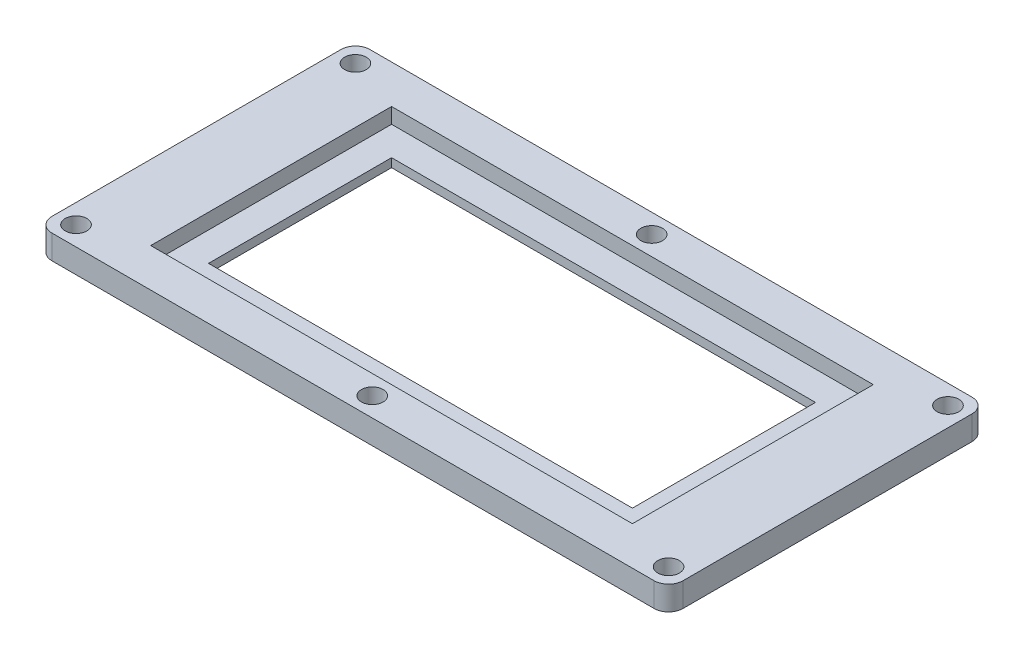
ISO-10303-21;
HEADER;
FILE_DESCRIPTION(('STEP AP214'),'2;1');
FILE_NAME('part.step','',(''),(''),'','','');
FILE_SCHEMA(('AUTOMOTIVE_DESIGN { 1 0 10303 214 1 1 1 1 }'));
ENDSEC;
DATA;
#1=APPLICATION_CONTEXT('core data for automotive mechanical design processes');
#2=APPLICATION_PROTOCOL_DEFINITION('international standard','automotive_design',2000,#1);
#3=PRODUCT_CONTEXT('',#1,'mechanical');
#4=PRODUCT('Part','Part','',(#3));
#5=PRODUCT_RELATED_PRODUCT_CATEGORY('part','',(#4));
#6=PRODUCT_DEFINITION_FORMATION('','',#4);
#7=PRODUCT_DEFINITION_CONTEXT('part definition',#1,'design');
#8=PRODUCT_DEFINITION('design','',#6,#7);
#9=PRODUCT_DEFINITION_SHAPE('','',#8);
#10=(LENGTH_UNIT() NAMED_UNIT(*) SI_UNIT(.MILLI.,.METRE.));
#11=(NAMED_UNIT(*) PLANE_ANGLE_UNIT() SI_UNIT($,.RADIAN.));
#12=(NAMED_UNIT(*) SI_UNIT($,.STERADIAN.) SOLID_ANGLE_UNIT());
#13=UNCERTAINTY_MEASURE_WITH_UNIT(LENGTH_MEASURE(1.E-05),#10,'distance_accuracy_value','');
#14=(GEOMETRIC_REPRESENTATION_CONTEXT(3) GLOBAL_UNCERTAINTY_ASSIGNED_CONTEXT((#13)) GLOBAL_UNIT_ASSIGNED_CONTEXT((#10,
#11,#12)) REPRESENTATION_CONTEXT('',''));
#15=CARTESIAN_POINT('',(0.,0.,0.));
#16=DIRECTION('',(0.,0.,1.));
#17=DIRECTION('',(1.,0.,0.));
#18=AXIS2_PLACEMENT_3D('',#15,#16,#17);
#19=CARTESIAN_POINT('',(65.5,5.,33.));
#20=DIRECTION('',(-1.,0.,0.));
#21=DIRECTION('',(0.,0.,1.));
#22=AXIS2_PLACEMENT_3D('',#19,#20,#21);
#23=PLANE('',#22);
#24=DIRECTION('',(0.,0.,-1.));
#25=VECTOR('',#24,1.);
#26=CARTESIAN_POINT('',(65.5,0.,33.));
#27=LINE('',#26,#25);
#28=CARTESIAN_POINT('',(65.5,0.,30.));
#29=VERTEX_POINT('',#28);
#30=CARTESIAN_POINT('',(65.5,0.,-30.));
#31=VERTEX_POINT('',#30);
#32=EDGE_CURVE('E251',#29,#31,#27,.T.);
#33=ORIENTED_EDGE('',*,*,#32,.T.);
#34=DIRECTION('',(0.,-1.,0.));
#35=VECTOR('',#34,1.);
#36=CARTESIAN_POINT('',(65.5,5.,-30.));
#37=LINE('',#36,#35);
#38=CARTESIAN_POINT('',(65.5,5.,-30.));
#39=VERTEX_POINT('',#38);
#40=EDGE_CURVE('E293',#31,#39,#37,.F.);
#41=ORIENTED_EDGE('',*,*,#40,.T.);
#42=DIRECTION('',(0.,0.,-1.));
#43=VECTOR('',#42,1.);
#44=CARTESIAN_POINT('',(65.5,5.,33.));
#45=LINE('',#44,#43);
#46=CARTESIAN_POINT('',(65.5,5.,30.));
#47=VERTEX_POINT('',#46);
#48=EDGE_CURVE('E254',#47,#39,#45,.T.);
#49=ORIENTED_EDGE('',*,*,#48,.F.);
#50=DIRECTION('',(0.,-1.,0.));
#51=VECTOR('',#50,1.);
#52=CARTESIAN_POINT('',(65.5,5.,30.));
#53=LINE('',#52,#51);
#54=EDGE_CURVE('E290',#47,#29,#53,.T.);
#55=ORIENTED_EDGE('',*,*,#54,.T.);
#56=EDGE_LOOP('',(#33,#41,#49,#55));
#57=FACE_BOUND('',#56,.T.);
#58=ADVANCED_FACE('F36',(#57),#23,.F.);
#59=CARTESIAN_POINT('',(-65.5,5.,-33.));
#60=DIRECTION('',(0.,0.,1.));
#61=DIRECTION('',(1.,0.,0.));
#62=AXIS2_PLACEMENT_3D('',#59,#60,#61);
#63=PLANE('',#62);
#64=DIRECTION('',(-1.,0.,0.));
#65=VECTOR('',#64,1.);
#66=CARTESIAN_POINT('',(-65.5,5.,-33.));
#67=LINE('',#66,#65);
#68=CARTESIAN_POINT('',(62.5,5.,-33.));
#69=VERTEX_POINT('',#68);
#70=CARTESIAN_POINT('',(-62.5,5.,-33.));
#71=VERTEX_POINT('',#70);
#72=EDGE_CURVE('E257',#69,#71,#67,.T.);
#73=ORIENTED_EDGE('',*,*,#72,.F.);
#74=DIRECTION('',(0.,-1.,0.));
#75=VECTOR('',#74,1.);
#76=CARTESIAN_POINT('',(62.5,5.,-33.));
#77=LINE('',#76,#75);
#78=CARTESIAN_POINT('',(62.5,0.,-33.));
#79=VERTEX_POINT('',#78);
#80=EDGE_CURVE('E279',#69,#79,#77,.T.);
#81=ORIENTED_EDGE('',*,*,#80,.T.);
#82=DIRECTION('',(-1.,0.,0.));
#83=VECTOR('',#82,1.);
#84=CARTESIAN_POINT('',(-65.5,0.,-33.));
#85=LINE('',#84,#83);
#86=CARTESIAN_POINT('',(-62.5,0.,-33.));
#87=VERTEX_POINT('',#86);
#88=EDGE_CURVE('E270',#79,#87,#85,.T.);
#89=ORIENTED_EDGE('',*,*,#88,.T.);
#90=DIRECTION('',(0.,-1.,0.));
#91=VECTOR('',#90,1.);
#92=CARTESIAN_POINT('',(-62.5,5.,-33.));
#93=LINE('',#92,#91);
#94=EDGE_CURVE('E267',#87,#71,#93,.F.);
#95=ORIENTED_EDGE('',*,*,#94,.T.);
#96=EDGE_LOOP('',(#73,#81,#89,#95));
#97=FACE_BOUND('',#96,.T.);
#98=ADVANCED_FACE('F335',(#97),#63,.F.);
#99=CARTESIAN_POINT('',(-65.5,5.,33.));
#100=DIRECTION('',(1.,0.,0.));
#101=DIRECTION('',(0.,0.,-1.));
#102=AXIS2_PLACEMENT_3D('',#99,#100,#101);
#103=PLANE('',#102);
#104=DIRECTION('',(0.,0.,1.));
#105=VECTOR('',#104,1.);
#106=CARTESIAN_POINT('',(-65.5,5.,33.));
#107=LINE('',#106,#105);
#108=CARTESIAN_POINT('',(-65.5,5.,-30.));
#109=VERTEX_POINT('',#108);
#110=CARTESIAN_POINT('',(-65.5,5.,30.));
#111=VERTEX_POINT('',#110);
#112=EDGE_CURVE('E261',#109,#111,#107,.T.);
#113=ORIENTED_EDGE('',*,*,#112,.F.);
#114=DIRECTION('',(0.,-1.,0.));
#115=VECTOR('',#114,1.);
#116=CARTESIAN_POINT('',(-65.5,5.,-30.));
#117=LINE('',#116,#115);
#118=CARTESIAN_POINT('',(-65.5,0.,-30.));
#119=VERTEX_POINT('',#118);
#120=EDGE_CURVE('E305',#109,#119,#117,.T.);
#121=ORIENTED_EDGE('',*,*,#120,.T.);
#122=DIRECTION('',(0.,0.,1.));
#123=VECTOR('',#122,1.);
#124=CARTESIAN_POINT('',(-65.5,0.,33.));
#125=LINE('',#124,#123);
#126=CARTESIAN_POINT('',(-65.5,0.,30.));
#127=VERTEX_POINT('',#126);
#128=EDGE_CURVE('E273',#119,#127,#125,.T.);
#129=ORIENTED_EDGE('',*,*,#128,.T.);
#130=DIRECTION('',(0.,-1.,0.));
#131=VECTOR('',#130,1.);
#132=CARTESIAN_POINT('',(-65.5,5.,30.));
#133=LINE('',#132,#131);
#134=EDGE_CURVE('E303',#127,#111,#133,.F.);
#135=ORIENTED_EDGE('',*,*,#134,.T.);
#136=EDGE_LOOP('',(#113,#121,#129,#135));
#137=FACE_BOUND('',#136,.T.);
#138=ADVANCED_FACE('F343',(#137),#103,.F.);
#139=CARTESIAN_POINT('',(-65.5,5.,33.));
#140=DIRECTION('',(0.,0.,-1.));
#141=DIRECTION('',(-1.,0.,0.));
#142=AXIS2_PLACEMENT_3D('',#139,#140,#141);
#143=PLANE('',#142);
#144=DIRECTION('',(1.,0.,0.));
#145=VECTOR('',#144,1.);
#146=CARTESIAN_POINT('',(-65.5,0.,33.));
#147=LINE('',#146,#145);
#148=CARTESIAN_POINT('',(-62.5,0.,33.));
#149=VERTEX_POINT('',#148);
#150=CARTESIAN_POINT('',(62.5,0.,33.));
#151=VERTEX_POINT('',#150);
#152=EDGE_CURVE('E258',#149,#151,#147,.T.);
#153=ORIENTED_EDGE('',*,*,#152,.T.);
#154=DIRECTION('',(0.,-1.,0.));
#155=VECTOR('',#154,1.);
#156=CARTESIAN_POINT('',(62.5,5.,33.));
#157=LINE('',#156,#155);
#158=CARTESIAN_POINT('',(62.5,5.,33.));
#159=VERTEX_POINT('',#158);
#160=EDGE_CURVE('E11',#151,#159,#157,.F.);
#161=ORIENTED_EDGE('',*,*,#160,.T.);
#162=DIRECTION('',(1.,0.,0.));
#163=VECTOR('',#162,1.);
#164=CARTESIAN_POINT('',(-65.5,5.,33.));
#165=LINE('',#164,#163);
#166=CARTESIAN_POINT('',(-62.5,5.,33.));
#167=VERTEX_POINT('',#166);
#168=EDGE_CURVE('E264',#167,#159,#165,.T.);
#169=ORIENTED_EDGE('',*,*,#168,.F.);
#170=DIRECTION('',(0.,-1.,0.));
#171=VECTOR('',#170,1.);
#172=CARTESIAN_POINT('',(-62.5,5.,33.));
#173=LINE('',#172,#171);
#174=EDGE_CURVE('E44',#167,#149,#173,.T.);
#175=ORIENTED_EDGE('',*,*,#174,.T.);
#176=EDGE_LOOP('',(#153,#161,#169,#175));
#177=FACE_BOUND('',#176,.T.);
#178=ADVANCED_FACE('F312',(#177),#143,.F.);
#179=CARTESIAN_POINT('',(0.,5.,0.));
#180=DIRECTION('',(0.,-1.,0.));
#181=DIRECTION('',(0.,0.,-1.));
#182=AXIS2_PLACEMENT_3D('',#179,#180,#181);
#183=PLANE('',#182);
#184=DIRECTION('',(1.,0.,0.));
#185=VECTOR('',#184,1.);
#186=CARTESIAN_POINT('',(50.,5.,25.));
#187=LINE('',#186,#185);
#188=CARTESIAN_POINT('',(-50.,5.,25.));
#189=VERTEX_POINT('',#188);
#190=CARTESIAN_POINT('',(50.,5.,25.));
#191=VERTEX_POINT('',#190);
#192=EDGE_CURVE('E201',#189,#191,#187,.T.);
#193=ORIENTED_EDGE('',*,*,#192,.F.);
#194=DIRECTION('',(0.,0.,1.));
#195=VECTOR('',#194,1.);
#196=CARTESIAN_POINT('',(-50.,5.,25.));
#197=LINE('',#196,#195);
#198=CARTESIAN_POINT('',(-50.,5.,-25.));
#199=VERTEX_POINT('',#198);
#200=EDGE_CURVE('E182',#199,#189,#197,.T.);
#201=ORIENTED_EDGE('',*,*,#200,.F.);
#202=DIRECTION('',(-1.,0.,0.));
#203=VECTOR('',#202,1.);
#204=CARTESIAN_POINT('',(50.,5.,-25.));
#205=LINE('',#204,#203);
#206=CARTESIAN_POINT('',(50.,5.,-25.));
#207=VERTEX_POINT('',#206);
#208=EDGE_CURVE('E190',#207,#199,#205,.T.);
#209=ORIENTED_EDGE('',*,*,#208,.F.);
#210=DIRECTION('',(0.,0.,-1.));
#211=VECTOR('',#210,1.);
#212=CARTESIAN_POINT('',(50.,5.,25.));
#213=LINE('',#212,#211);
#214=EDGE_CURVE('E204',#191,#207,#213,.T.);
#215=ORIENTED_EDGE('',*,*,#214,.F.);
#216=EDGE_LOOP('',(#193,#201,#209,#215));
#217=FACE_BOUND('',#216,.T.);
#218=CARTESIAN_POINT('',(61.5,5.,-29.));
#219=DIRECTION('',(0.,1.,0.));
#220=DIRECTION('',(0.,0.,1.));
#221=AXIS2_PLACEMENT_3D('',#218,#219,#220);
#222=CIRCLE('',#221,2.25);
#223=CARTESIAN_POINT('',(61.5,5.,-26.75));
#224=VERTEX_POINT('',#223);
#225=EDGE_CURVE('E228',#224,#224,#222,.T.);
#226=ORIENTED_EDGE('',*,*,#225,.F.);
#227=EDGE_LOOP('',(#226));
#228=FACE_BOUND('',#227,.T.);
#229=CARTESIAN_POINT('',(61.5,5.,29.));
#230=DIRECTION('',(0.,1.,0.));
#231=DIRECTION('',(0.,0.,1.));
#232=AXIS2_PLACEMENT_3D('',#229,#230,#231);
#233=CIRCLE('',#232,2.25);
#234=CARTESIAN_POINT('',(61.5,5.,31.25));
#235=VERTEX_POINT('',#234);
#236=EDGE_CURVE('E234',#235,#235,#233,.T.);
#237=ORIENTED_EDGE('',*,*,#236,.F.);
#238=EDGE_LOOP('',(#237));
#239=FACE_BOUND('',#238,.T.);
#240=CARTESIAN_POINT('',(-61.5,5.,29.));
#241=DIRECTION('',(0.,1.,0.));
#242=DIRECTION('',(0.,0.,1.));
#243=AXIS2_PLACEMENT_3D('',#240,#241,#242);
#244=CIRCLE('',#243,2.25);
#245=CARTESIAN_POINT('',(-61.5,5.,31.25));
#246=VERTEX_POINT('',#245);
#247=EDGE_CURVE('E240',#246,#246,#244,.T.);
#248=ORIENTED_EDGE('',*,*,#247,.F.);
#249=EDGE_LOOP('',(#248));
#250=FACE_BOUND('',#249,.T.);
#251=CARTESIAN_POINT('',(0.,5.,-29.));
#252=DIRECTION('',(0.,1.,0.));
#253=DIRECTION('',(0.,0.,1.));
#254=AXIS2_PLACEMENT_3D('',#251,#252,#253);
#255=CIRCLE('',#254,2.25);
#256=CARTESIAN_POINT('',(0.,5.,-26.75));
#257=VERTEX_POINT('',#256);
#258=EDGE_CURVE('E221',#257,#257,#255,.T.);
#259=ORIENTED_EDGE('',*,*,#258,.F.);
#260=EDGE_LOOP('',(#259));
#261=FACE_BOUND('',#260,.T.);
#262=CARTESIAN_POINT('',(0.,5.,29.));
#263=DIRECTION('',(0.,1.,0.));
#264=DIRECTION('',(0.,0.,1.));
#265=AXIS2_PLACEMENT_3D('',#262,#263,#264);
#266=CIRCLE('',#265,2.25);
#267=CARTESIAN_POINT('',(0.,5.,31.25));
#268=VERTEX_POINT('',#267);
#269=EDGE_CURVE('E211',#268,#268,#266,.T.);
#270=ORIENTED_EDGE('',*,*,#269,.F.);
#271=EDGE_LOOP('',(#270));
#272=FACE_BOUND('',#271,.T.);
#273=CARTESIAN_POINT('',(-61.5,5.,-29.));
#274=DIRECTION('',(0.,1.,0.));
#275=DIRECTION('',(0.,0.,1.));
#276=AXIS2_PLACEMENT_3D('',#273,#274,#275);
#277=CIRCLE('',#276,2.25);
#278=CARTESIAN_POINT('',(-61.5,5.,-26.75));
#279=VERTEX_POINT('',#278);
#280=EDGE_CURVE('E227',#279,#279,#277,.T.);
#281=ORIENTED_EDGE('',*,*,#280,.F.);
#282=EDGE_LOOP('',(#281));
#283=FACE_BOUND('',#282,.T.);
#284=ORIENTED_EDGE('',*,*,#48,.T.);
#285=CARTESIAN_POINT('',(62.5,5.,-30.));
#286=DIRECTION('',(0.,-1.,0.));
#287=DIRECTION('',(0.,0.,-1.));
#288=AXIS2_PLACEMENT_3D('',#285,#286,#287);
#289=CIRCLE('',#288,3.);
#290=EDGE_CURVE('E301',#39,#69,#289,.F.);
#291=ORIENTED_EDGE('',*,*,#290,.T.);
#292=ORIENTED_EDGE('',*,*,#72,.T.);
#293=CARTESIAN_POINT('',(-62.5,5.,-30.));
#294=DIRECTION('',(0.,-1.,0.));
#295=DIRECTION('',(0.,0.,-1.));
#296=AXIS2_PLACEMENT_3D('',#293,#294,#295);
#297=CIRCLE('',#296,3.);
#298=EDGE_CURVE('E299',#71,#109,#297,.F.);
#299=ORIENTED_EDGE('',*,*,#298,.T.);
#300=ORIENTED_EDGE('',*,*,#112,.T.);
#301=CARTESIAN_POINT('',(-62.5,5.,30.));
#302=DIRECTION('',(0.,-1.,0.));
#303=DIRECTION('',(0.,0.,-1.));
#304=AXIS2_PLACEMENT_3D('',#301,#302,#303);
#305=CIRCLE('',#304,3.);
#306=EDGE_CURVE('E295',#111,#167,#305,.F.);
#307=ORIENTED_EDGE('',*,*,#306,.T.);
#308=ORIENTED_EDGE('',*,*,#168,.T.);
#309=CARTESIAN_POINT('',(62.5,5.,30.));
#310=DIRECTION('',(0.,-1.,0.));
#311=DIRECTION('',(0.,0.,-1.));
#312=AXIS2_PLACEMENT_3D('',#309,#310,#311);
#313=CIRCLE('',#312,3.);
#314=EDGE_CURVE('E297',#159,#47,#313,.F.);
#315=ORIENTED_EDGE('',*,*,#314,.T.);
#316=EDGE_LOOP('',(#284,#291,#292,#299,#300,#307,#308,#315));
#317=FACE_BOUND('',#316,.T.);
#318=ADVANCED_FACE('F329',(#217,#228,#239,#250,#261,#272,#283,#317),#183,.F.);
#319=CARTESIAN_POINT('',(0.,0.,0.));
#320=DIRECTION('',(0.,-1.,0.));
#321=DIRECTION('',(0.,0.,-1.));
#322=AXIS2_PLACEMENT_3D('',#319,#320,#321);
#323=PLANE('',#322);
#324=DIRECTION('',(1.,0.,0.));
#325=VECTOR('',#324,1.);
#326=CARTESIAN_POINT('',(-44.,0.,19.));
#327=LINE('',#326,#325);
#328=CARTESIAN_POINT('',(-44.,0.,19.));
#329=VERTEX_POINT('',#328);
#330=CARTESIAN_POINT('',(44.,0.,19.));
#331=VERTEX_POINT('',#330);
#332=EDGE_CURVE('E151',#329,#331,#327,.T.);
#333=ORIENTED_EDGE('',*,*,#332,.T.);
#334=DIRECTION('',(0.,0.,-1.));
#335=VECTOR('',#334,1.);
#336=CARTESIAN_POINT('',(44.,0.,19.));
#337=LINE('',#336,#335);
#338=CARTESIAN_POINT('',(44.,0.,-19.));
#339=VERTEX_POINT('',#338);
#340=EDGE_CURVE('E162',#331,#339,#337,.T.);
#341=ORIENTED_EDGE('',*,*,#340,.T.);
#342=DIRECTION('',(-1.,0.,0.));
#343=VECTOR('',#342,1.);
#344=CARTESIAN_POINT('',(44.,0.,-19.));
#345=LINE('',#344,#343);
#346=CARTESIAN_POINT('',(-44.,0.,-19.));
#347=VERTEX_POINT('',#346);
#348=EDGE_CURVE('E56',#339,#347,#345,.T.);
#349=ORIENTED_EDGE('',*,*,#348,.T.);
#350=DIRECTION('',(0.,0.,1.));
#351=VECTOR('',#350,1.);
#352=CARTESIAN_POINT('',(-44.,0.,-19.));
#353=LINE('',#352,#351);
#354=EDGE_CURVE('E159',#347,#329,#353,.T.);
#355=ORIENTED_EDGE('',*,*,#354,.T.);
#356=EDGE_LOOP('',(#333,#341,#349,#355));
#357=FACE_BOUND('',#356,.T.);
#358=CARTESIAN_POINT('',(61.5,0.,-29.));
#359=DIRECTION('',(0.,1.,0.));
#360=DIRECTION('',(0.,0.,1.));
#361=AXIS2_PLACEMENT_3D('',#358,#359,#360);
#362=CIRCLE('',#361,2.25);
#363=CARTESIAN_POINT('',(61.5,0.,-26.75));
#364=VERTEX_POINT('',#363);
#365=EDGE_CURVE('E224',#364,#364,#362,.T.);
#366=ORIENTED_EDGE('',*,*,#365,.T.);
#367=EDGE_LOOP('',(#366));
#368=FACE_BOUND('',#367,.T.);
#369=CARTESIAN_POINT('',(61.5,0.,29.));
#370=DIRECTION('',(0.,1.,0.));
#371=DIRECTION('',(0.,0.,1.));
#372=AXIS2_PLACEMENT_3D('',#369,#370,#371);
#373=CIRCLE('',#372,2.25);
#374=CARTESIAN_POINT('',(61.5,0.,31.25));
#375=VERTEX_POINT('',#374);
#376=EDGE_CURVE('E231',#375,#375,#373,.T.);
#377=ORIENTED_EDGE('',*,*,#376,.T.);
#378=EDGE_LOOP('',(#377));
#379=FACE_BOUND('',#378,.T.);
#380=CARTESIAN_POINT('',(-61.5,0.,29.));
#381=DIRECTION('',(0.,1.,0.));
#382=DIRECTION('',(0.,0.,1.));
#383=AXIS2_PLACEMENT_3D('',#380,#381,#382);
#384=CIRCLE('',#383,2.25);
#385=CARTESIAN_POINT('',(-61.5,0.,31.25));
#386=VERTEX_POINT('',#385);
#387=EDGE_CURVE('E237',#386,#386,#384,.T.);
#388=ORIENTED_EDGE('',*,*,#387,.T.);
#389=EDGE_LOOP('',(#388));
#390=FACE_BOUND('',#389,.T.);
#391=CARTESIAN_POINT('',(0.,0.,-29.));
#392=DIRECTION('',(0.,1.,0.));
#393=DIRECTION('',(0.,0.,1.));
#394=AXIS2_PLACEMENT_3D('',#391,#392,#393);
#395=CIRCLE('',#394,2.25);
#396=CARTESIAN_POINT('',(0.,0.,-26.75));
#397=VERTEX_POINT('',#396);
#398=EDGE_CURVE('E243',#397,#397,#395,.T.);
#399=ORIENTED_EDGE('',*,*,#398,.T.);
#400=EDGE_LOOP('',(#399));
#401=FACE_BOUND('',#400,.T.);
#402=CARTESIAN_POINT('',(0.,0.,29.));
#403=DIRECTION('',(0.,1.,0.));
#404=DIRECTION('',(0.,0.,1.));
#405=AXIS2_PLACEMENT_3D('',#402,#403,#404);
#406=CIRCLE('',#405,2.25);
#407=CARTESIAN_POINT('',(0.,0.,31.25));
#408=VERTEX_POINT('',#407);
#409=EDGE_CURVE('E218',#408,#408,#406,.T.);
#410=ORIENTED_EDGE('',*,*,#409,.T.);
#411=EDGE_LOOP('',(#410));
#412=FACE_BOUND('',#411,.T.);
#413=CARTESIAN_POINT('',(-61.5,0.,-29.));
#414=DIRECTION('',(0.,1.,0.));
#415=DIRECTION('',(0.,0.,1.));
#416=AXIS2_PLACEMENT_3D('',#413,#414,#415);
#417=CIRCLE('',#416,2.25);
#418=CARTESIAN_POINT('',(-61.5,0.,-26.75));
#419=VERTEX_POINT('',#418);
#420=EDGE_CURVE('E248',#419,#419,#417,.T.);
#421=ORIENTED_EDGE('',*,*,#420,.T.);
#422=EDGE_LOOP('',(#421));
#423=FACE_BOUND('',#422,.T.);
#424=ORIENTED_EDGE('',*,*,#88,.F.);
#425=CARTESIAN_POINT('',(62.5,0.,-30.));
#426=DIRECTION('',(0.,-1.,0.));
#427=DIRECTION('',(0.,0.,-1.));
#428=AXIS2_PLACEMENT_3D('',#425,#426,#427);
#429=CIRCLE('',#428,3.);
#430=EDGE_CURVE('E288',#79,#31,#429,.T.);
#431=ORIENTED_EDGE('',*,*,#430,.T.);
#432=ORIENTED_EDGE('',*,*,#32,.F.);
#433=CARTESIAN_POINT('',(62.5,0.,30.));
#434=DIRECTION('',(0.,-1.,0.));
#435=DIRECTION('',(0.,0.,-1.));
#436=AXIS2_PLACEMENT_3D('',#433,#434,#435);
#437=CIRCLE('',#436,3.);
#438=EDGE_CURVE('E284',#29,#151,#437,.T.);
#439=ORIENTED_EDGE('',*,*,#438,.T.);
#440=ORIENTED_EDGE('',*,*,#152,.F.);
#441=CARTESIAN_POINT('',(-62.5,0.,30.));
#442=DIRECTION('',(0.,-1.,0.));
#443=DIRECTION('',(0.,0.,-1.));
#444=AXIS2_PLACEMENT_3D('',#441,#442,#443);
#445=CIRCLE('',#444,3.);
#446=EDGE_CURVE('E282',#149,#127,#445,.T.);
#447=ORIENTED_EDGE('',*,*,#446,.T.);
#448=ORIENTED_EDGE('',*,*,#128,.F.);
#449=CARTESIAN_POINT('',(-62.5,0.,-30.));
#450=DIRECTION('',(0.,-1.,0.));
#451=DIRECTION('',(0.,0.,-1.));
#452=AXIS2_PLACEMENT_3D('',#449,#450,#451);
#453=CIRCLE('',#452,3.);
#454=EDGE_CURVE('E286',#119,#87,#453,.T.);
#455=ORIENTED_EDGE('',*,*,#454,.T.);
#456=EDGE_LOOP('',(#424,#431,#432,#439,#440,#447,#448,#455));
#457=FACE_BOUND('',#456,.T.);
#458=ADVANCED_FACE('F166',(#357,#368,#379,#390,#401,#412,#423,#457),#323,.T.);
#459=CARTESIAN_POINT('',(62.5,5.,-30.));
#460=DIRECTION('',(0.,-1.,0.));
#461=DIRECTION('',(0.,0.,-1.));
#462=AXIS2_PLACEMENT_3D('',#459,#460,#461);
#463=CYLINDRICAL_SURFACE('',#462,3.);
#464=ORIENTED_EDGE('',*,*,#290,.F.);
#465=ORIENTED_EDGE('',*,*,#40,.F.);
#466=ORIENTED_EDGE('',*,*,#430,.F.);
#467=ORIENTED_EDGE('',*,*,#80,.F.);
#468=EDGE_LOOP('',(#464,#465,#466,#467));
#469=FACE_BOUND('',#468,.T.);
#470=ADVANCED_FACE('F333',(#469),#463,.T.);
#471=CARTESIAN_POINT('',(-62.5,5.,-30.));
#472=DIRECTION('',(0.,-1.,0.));
#473=DIRECTION('',(0.,0.,-1.));
#474=AXIS2_PLACEMENT_3D('',#471,#472,#473);
#475=CYLINDRICAL_SURFACE('',#474,3.);
#476=ORIENTED_EDGE('',*,*,#298,.F.);
#477=ORIENTED_EDGE('',*,*,#94,.F.);
#478=ORIENTED_EDGE('',*,*,#454,.F.);
#479=ORIENTED_EDGE('',*,*,#120,.F.);
#480=EDGE_LOOP('',(#476,#477,#478,#479));
#481=FACE_BOUND('',#480,.T.);
#482=ADVANCED_FACE('F340',(#481),#475,.T.);
#483=CARTESIAN_POINT('',(62.5,5.,30.));
#484=DIRECTION('',(0.,-1.,0.));
#485=DIRECTION('',(0.,0.,-1.));
#486=AXIS2_PLACEMENT_3D('',#483,#484,#485);
#487=CYLINDRICAL_SURFACE('',#486,3.);
#488=ORIENTED_EDGE('',*,*,#314,.F.);
#489=ORIENTED_EDGE('',*,*,#160,.F.);
#490=ORIENTED_EDGE('',*,*,#438,.F.);
#491=ORIENTED_EDGE('',*,*,#54,.F.);
#492=EDGE_LOOP('',(#488,#489,#490,#491));
#493=FACE_BOUND('',#492,.T.);
#494=ADVANCED_FACE('F323',(#493),#487,.T.);
#495=CARTESIAN_POINT('',(-62.5,5.,30.));
#496=DIRECTION('',(0.,-1.,0.));
#497=DIRECTION('',(0.,0.,-1.));
#498=AXIS2_PLACEMENT_3D('',#495,#496,#497);
#499=CYLINDRICAL_SURFACE('',#498,3.);
#500=ORIENTED_EDGE('',*,*,#306,.F.);
#501=ORIENTED_EDGE('',*,*,#134,.F.);
#502=ORIENTED_EDGE('',*,*,#446,.F.);
#503=ORIENTED_EDGE('',*,*,#174,.F.);
#504=EDGE_LOOP('',(#500,#501,#502,#503));
#505=FACE_BOUND('',#504,.T.);
#506=ADVANCED_FACE('F38',(#505),#499,.T.);
#507=CARTESIAN_POINT('',(-61.5,0.,-29.));
#508=DIRECTION('',(0.,1.,0.));
#509=DIRECTION('',(0.,0.,1.));
#510=AXIS2_PLACEMENT_3D('',#507,#508,#509);
#511=CYLINDRICAL_SURFACE('',#510,2.25);
#512=ORIENTED_EDGE('',*,*,#420,.F.);
#513=EDGE_LOOP('',(#512));
#514=FACE_BOUND('',#513,.T.);
#515=ORIENTED_EDGE('',*,*,#280,.T.);
#516=EDGE_LOOP('',(#515));
#517=FACE_BOUND('',#516,.T.);
#518=ADVANCED_FACE('F346',(#514,#517),#511,.F.);
#519=CARTESIAN_POINT('',(0.,0.,29.));
#520=DIRECTION('',(0.,1.,0.));
#521=DIRECTION('',(0.,0.,1.));
#522=AXIS2_PLACEMENT_3D('',#519,#520,#521);
#523=CYLINDRICAL_SURFACE('',#522,2.25);
#524=ORIENTED_EDGE('',*,*,#409,.F.);
#525=EDGE_LOOP('',(#524));
#526=FACE_BOUND('',#525,.T.);
#527=ORIENTED_EDGE('',*,*,#269,.T.);
#528=EDGE_LOOP('',(#527));
#529=FACE_BOUND('',#528,.T.);
#530=ADVANCED_FACE('F351',(#526,#529),#523,.F.);
#531=CARTESIAN_POINT('',(0.,0.,-29.));
#532=DIRECTION('',(0.,1.,0.));
#533=DIRECTION('',(0.,0.,1.));
#534=AXIS2_PLACEMENT_3D('',#531,#532,#533);
#535=CYLINDRICAL_SURFACE('',#534,2.25);
#536=ORIENTED_EDGE('',*,*,#398,.F.);
#537=EDGE_LOOP('',(#536));
#538=FACE_BOUND('',#537,.T.);
#539=ORIENTED_EDGE('',*,*,#258,.T.);
#540=EDGE_LOOP('',(#539));
#541=FACE_BOUND('',#540,.T.);
#542=ADVANCED_FACE('F393',(#538,#541),#535,.F.);
#543=CARTESIAN_POINT('',(-61.5,0.,29.));
#544=DIRECTION('',(0.,1.,0.));
#545=DIRECTION('',(0.,0.,1.));
#546=AXIS2_PLACEMENT_3D('',#543,#544,#545);
#547=CYLINDRICAL_SURFACE('',#546,2.25);
#548=ORIENTED_EDGE('',*,*,#387,.F.);
#549=EDGE_LOOP('',(#548));
#550=FACE_BOUND('',#549,.T.);
#551=ORIENTED_EDGE('',*,*,#247,.T.);
#552=EDGE_LOOP('',(#551));
#553=FACE_BOUND('',#552,.T.);
#554=ADVANCED_FACE('F403',(#550,#553),#547,.F.);
#555=CARTESIAN_POINT('',(61.5,0.,29.));
#556=DIRECTION('',(0.,1.,0.));
#557=DIRECTION('',(0.,0.,1.));
#558=AXIS2_PLACEMENT_3D('',#555,#556,#557);
#559=CYLINDRICAL_SURFACE('',#558,2.25);
#560=ORIENTED_EDGE('',*,*,#376,.F.);
#561=EDGE_LOOP('',(#560));
#562=FACE_BOUND('',#561,.T.);
#563=ORIENTED_EDGE('',*,*,#236,.T.);
#564=EDGE_LOOP('',(#563));
#565=FACE_BOUND('',#564,.T.);
#566=ADVANCED_FACE('F413',(#562,#565),#559,.F.);
#567=CARTESIAN_POINT('',(61.5,0.,-29.));
#568=DIRECTION('',(0.,1.,0.));
#569=DIRECTION('',(0.,0.,1.));
#570=AXIS2_PLACEMENT_3D('',#567,#568,#569);
#571=CYLINDRICAL_SURFACE('',#570,2.25);
#572=ORIENTED_EDGE('',*,*,#365,.F.);
#573=EDGE_LOOP('',(#572));
#574=FACE_BOUND('',#573,.T.);
#575=ORIENTED_EDGE('',*,*,#225,.T.);
#576=EDGE_LOOP('',(#575));
#577=FACE_BOUND('',#576,.T.);
#578=ADVANCED_FACE('F423',(#574,#577),#571,.F.);
#579=CARTESIAN_POINT('',(-50.,1.8,25.));
#580=DIRECTION('',(-1.,0.,0.));
#581=DIRECTION('',(0.,0.,1.));
#582=AXIS2_PLACEMENT_3D('',#579,#580,#581);
#583=PLANE('',#582);
#584=ORIENTED_EDGE('',*,*,#200,.T.);
#585=DIRECTION('',(0.,1.,0.));
#586=VECTOR('',#585,1.);
#587=CARTESIAN_POINT('',(-50.,1.8,25.));
#588=LINE('',#587,#586);
#589=CARTESIAN_POINT('',(-50.,1.8,25.));
#590=VERTEX_POINT('',#589);
#591=EDGE_CURVE('E199',#590,#189,#588,.T.);
#592=ORIENTED_EDGE('',*,*,#591,.F.);
#593=DIRECTION('',(0.,0.,1.));
#594=VECTOR('',#593,1.);
#595=CARTESIAN_POINT('',(-50.,1.8,25.));
#596=LINE('',#595,#594);
#597=CARTESIAN_POINT('',(-50.,1.8,-25.));
#598=VERTEX_POINT('',#597);
#599=EDGE_CURVE('E186',#598,#590,#596,.T.);
#600=ORIENTED_EDGE('',*,*,#599,.F.);
#601=DIRECTION('',(0.,1.,0.));
#602=VECTOR('',#601,1.);
#603=CARTESIAN_POINT('',(-50.,1.8,-25.));
#604=LINE('',#603,#602);
#605=EDGE_CURVE('E209',#598,#199,#604,.T.);
#606=ORIENTED_EDGE('',*,*,#605,.T.);
#607=EDGE_LOOP('',(#584,#592,#600,#606));
#608=FACE_BOUND('',#607,.T.);
#609=ADVANCED_FACE('F433',(#608),#583,.F.);
#610=CARTESIAN_POINT('',(50.,1.8,-25.));
#611=DIRECTION('',(0.,0.,-1.));
#612=DIRECTION('',(-1.,0.,0.));
#613=AXIS2_PLACEMENT_3D('',#610,#611,#612);
#614=PLANE('',#613);
#615=ORIENTED_EDGE('',*,*,#208,.T.);
#616=ORIENTED_EDGE('',*,*,#605,.F.);
#617=DIRECTION('',(-1.,0.,0.));
#618=VECTOR('',#617,1.);
#619=CARTESIAN_POINT('',(50.,1.8,-25.));
#620=LINE('',#619,#618);
#621=CARTESIAN_POINT('',(50.,1.8,-25.));
#622=VERTEX_POINT('',#621);
#623=EDGE_CURVE('E196',#622,#598,#620,.T.);
#624=ORIENTED_EDGE('',*,*,#623,.F.);
#625=DIRECTION('',(0.,1.,0.));
#626=VECTOR('',#625,1.);
#627=CARTESIAN_POINT('',(50.,1.8,-25.));
#628=LINE('',#627,#626);
#629=EDGE_CURVE('E212',#622,#207,#628,.T.);
#630=ORIENTED_EDGE('',*,*,#629,.T.);
#631=EDGE_LOOP('',(#615,#616,#624,#630));
#632=FACE_BOUND('',#631,.T.);
#633=ADVANCED_FACE('F455',(#632),#614,.F.);
#634=CARTESIAN_POINT('',(50.,1.8,25.));
#635=DIRECTION('',(1.,0.,0.));
#636=DIRECTION('',(0.,0.,-1.));
#637=AXIS2_PLACEMENT_3D('',#634,#635,#636);
#638=PLANE('',#637);
#639=ORIENTED_EDGE('',*,*,#214,.T.);
#640=ORIENTED_EDGE('',*,*,#629,.F.);
#641=DIRECTION('',(0.,0.,-1.));
#642=VECTOR('',#641,1.);
#643=CARTESIAN_POINT('',(50.,1.8,25.));
#644=LINE('',#643,#642);
#645=CARTESIAN_POINT('',(50.,1.8,25.));
#646=VERTEX_POINT('',#645);
#647=EDGE_CURVE('E193',#646,#622,#644,.T.);
#648=ORIENTED_EDGE('',*,*,#647,.F.);
#649=DIRECTION('',(0.,1.,0.));
#650=VECTOR('',#649,1.);
#651=CARTESIAN_POINT('',(50.,1.8,25.));
#652=LINE('',#651,#650);
#653=EDGE_CURVE('E214',#646,#191,#652,.T.);
#654=ORIENTED_EDGE('',*,*,#653,.T.);
#655=EDGE_LOOP('',(#639,#640,#648,#654));
#656=FACE_BOUND('',#655,.T.);
#657=ADVANCED_FACE('F465',(#656),#638,.F.);
#658=CARTESIAN_POINT('',(50.,1.8,25.));
#659=DIRECTION('',(0.,0.,1.));
#660=DIRECTION('',(1.,0.,0.));
#661=AXIS2_PLACEMENT_3D('',#658,#659,#660);
#662=PLANE('',#661);
#663=ORIENTED_EDGE('',*,*,#192,.T.);
#664=ORIENTED_EDGE('',*,*,#653,.F.);
#665=DIRECTION('',(1.,0.,0.));
#666=VECTOR('',#665,1.);
#667=CARTESIAN_POINT('',(50.,1.8,25.));
#668=LINE('',#667,#666);
#669=EDGE_CURVE('E189',#590,#646,#668,.T.);
#670=ORIENTED_EDGE('',*,*,#669,.F.);
#671=ORIENTED_EDGE('',*,*,#591,.T.);
#672=EDGE_LOOP('',(#663,#664,#670,#671));
#673=FACE_BOUND('',#672,.T.);
#674=ADVANCED_FACE('F475',(#673),#662,.F.);
#675=CARTESIAN_POINT('',(0.,1.8,0.));
#676=DIRECTION('',(0.,1.,0.));
#677=DIRECTION('',(0.,0.,1.));
#678=AXIS2_PLACEMENT_3D('',#675,#676,#677);
#679=PLANE('',#678);
#680=DIRECTION('',(1.,0.,0.));
#681=VECTOR('',#680,1.);
#682=CARTESIAN_POINT('',(-44.,1.8,19.));
#683=LINE('',#682,#681);
#684=CARTESIAN_POINT('',(-44.,1.8,19.));
#685=VERTEX_POINT('',#684);
#686=CARTESIAN_POINT('',(44.,1.8,19.));
#687=VERTEX_POINT('',#686);
#688=EDGE_CURVE('E154',#685,#687,#683,.T.);
#689=ORIENTED_EDGE('',*,*,#688,.F.);
#690=DIRECTION('',(0.,0.,1.));
#691=VECTOR('',#690,1.);
#692=CARTESIAN_POINT('',(-44.,1.8,-19.));
#693=LINE('',#692,#691);
#694=CARTESIAN_POINT('',(-44.,1.8,-19.));
#695=VERTEX_POINT('',#694);
#696=EDGE_CURVE('E169',#695,#685,#693,.T.);
#697=ORIENTED_EDGE('',*,*,#696,.F.);
#698=DIRECTION('',(-1.,0.,0.));
#699=VECTOR('',#698,1.);
#700=CARTESIAN_POINT('',(44.,1.8,-19.));
#701=LINE('',#700,#699);
#702=CARTESIAN_POINT('',(44.,1.8,-19.));
#703=VERTEX_POINT('',#702);
#704=EDGE_CURVE('E51',#703,#695,#701,.T.);
#705=ORIENTED_EDGE('',*,*,#704,.F.);
#706=DIRECTION('',(0.,0.,-1.));
#707=VECTOR('',#706,1.);
#708=CARTESIAN_POINT('',(44.,1.8,19.));
#709=LINE('',#708,#707);
#710=EDGE_CURVE('E177',#687,#703,#709,.T.);
#711=ORIENTED_EDGE('',*,*,#710,.F.);
#712=EDGE_LOOP('',(#689,#697,#705,#711));
#713=FACE_BOUND('',#712,.T.);
#714=ORIENTED_EDGE('',*,*,#599,.T.);
#715=ORIENTED_EDGE('',*,*,#669,.T.);
#716=ORIENTED_EDGE('',*,*,#647,.T.);
#717=ORIENTED_EDGE('',*,*,#623,.T.);
#718=EDGE_LOOP('',(#714,#715,#716,#717));
#719=FACE_BOUND('',#718,.T.);
#720=ADVANCED_FACE('F485',(#713,#719),#679,.T.);
#721=CARTESIAN_POINT('',(-44.,0.,19.));
#722=DIRECTION('',(0.,0.,1.));
#723=DIRECTION('',(1.,0.,0.));
#724=AXIS2_PLACEMENT_3D('',#721,#722,#723);
#725=PLANE('',#724);
#726=ORIENTED_EDGE('',*,*,#688,.T.);
#727=DIRECTION('',(0.,1.,0.));
#728=VECTOR('',#727,1.);
#729=CARTESIAN_POINT('',(44.,0.,19.));
#730=LINE('',#729,#728);
#731=EDGE_CURVE('E147',#331,#687,#730,.T.);
#732=ORIENTED_EDGE('',*,*,#731,.F.);
#733=ORIENTED_EDGE('',*,*,#332,.F.);
#734=DIRECTION('',(0.,1.,0.));
#735=VECTOR('',#734,1.);
#736=CARTESIAN_POINT('',(-44.,0.,19.));
#737=LINE('',#736,#735);
#738=EDGE_CURVE('E180',#329,#685,#737,.T.);
#739=ORIENTED_EDGE('',*,*,#738,.T.);
#740=EDGE_LOOP('',(#726,#732,#733,#739));
#741=FACE_BOUND('',#740,.T.);
#742=ADVANCED_FACE('F149',(#741),#725,.F.);
#743=CARTESIAN_POINT('',(-44.,0.,-19.));
#744=DIRECTION('',(-1.,0.,0.));
#745=DIRECTION('',(0.,0.,1.));
#746=AXIS2_PLACEMENT_3D('',#743,#744,#745);
#747=PLANE('',#746);
#748=ORIENTED_EDGE('',*,*,#696,.T.);
#749=ORIENTED_EDGE('',*,*,#738,.F.);
#750=ORIENTED_EDGE('',*,*,#354,.F.);
#751=DIRECTION('',(0.,1.,0.));
#752=VECTOR('',#751,1.);
#753=CARTESIAN_POINT('',(-44.,0.,-19.));
#754=LINE('',#753,#752);
#755=EDGE_CURVE('E183',#347,#695,#754,.T.);
#756=ORIENTED_EDGE('',*,*,#755,.T.);
#757=EDGE_LOOP('',(#748,#749,#750,#756));
#758=FACE_BOUND('',#757,.T.);
#759=ADVANCED_FACE('F511',(#758),#747,.F.);
#760=CARTESIAN_POINT('',(44.,0.,-19.));
#761=DIRECTION('',(0.,0.,-1.));
#762=DIRECTION('',(-1.,0.,0.));
#763=AXIS2_PLACEMENT_3D('',#760,#761,#762);
#764=PLANE('',#763);
#765=ORIENTED_EDGE('',*,*,#704,.T.);
#766=ORIENTED_EDGE('',*,*,#755,.F.);
#767=ORIENTED_EDGE('',*,*,#348,.F.);
#768=DIRECTION('',(0.,1.,0.));
#769=VECTOR('',#768,1.);
#770=CARTESIAN_POINT('',(44.,0.,-19.));
#771=LINE('',#770,#769);
#772=EDGE_CURVE('E158',#339,#703,#771,.T.);
#773=ORIENTED_EDGE('',*,*,#772,.T.);
#774=EDGE_LOOP('',(#765,#766,#767,#773));
#775=FACE_BOUND('',#774,.T.);
#776=ADVANCED_FACE('F520',(#775),#764,.F.);
#777=CARTESIAN_POINT('',(44.,0.,19.));
#778=DIRECTION('',(1.,0.,0.));
#779=DIRECTION('',(0.,0.,-1.));
#780=AXIS2_PLACEMENT_3D('',#777,#778,#779);
#781=PLANE('',#780);
#782=ORIENTED_EDGE('',*,*,#710,.T.);
#783=ORIENTED_EDGE('',*,*,#772,.F.);
#784=ORIENTED_EDGE('',*,*,#340,.F.);
#785=ORIENTED_EDGE('',*,*,#731,.T.);
#786=EDGE_LOOP('',(#782,#783,#784,#785));
#787=FACE_BOUND('',#786,.T.);
#788=ADVANCED_FACE('F163',(#787),#781,.F.);
#789=CLOSED_SHELL('',(#58,#98,#138,#178,#318,#458,#470,#482,#494,#506,#518,#530,#542,#554,#566,
#578,#609,#633,#657,#674,#720,#742,#759,#776,#788));
#790=MANIFOLD_SOLID_BREP('B2',#789);
#791=ADVANCED_BREP_SHAPE_REPRESENTATION('',(#18,#790),#14);
#792=SHAPE_DEFINITION_REPRESENTATION(#9,#791);
ENDSEC;
END-ISO-10303-21;
